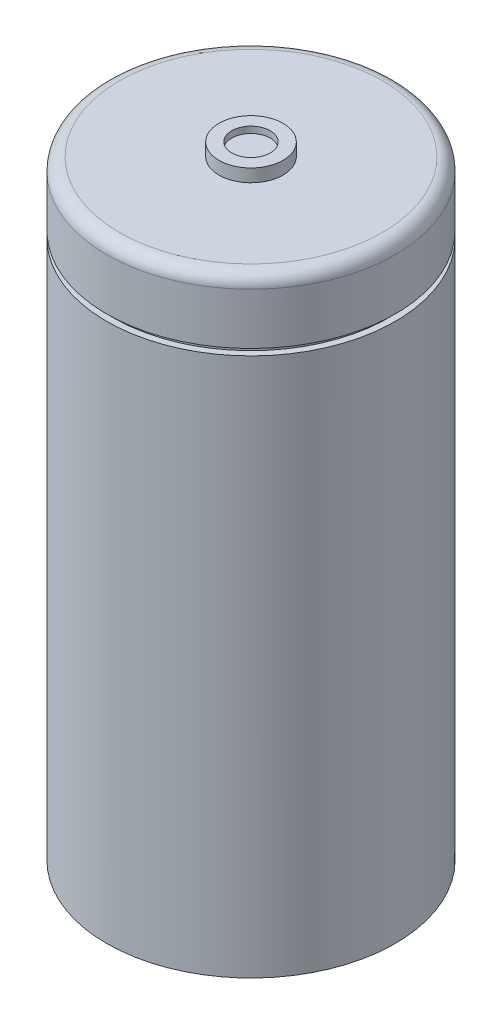
ISO-10303-21;
HEADER;
FILE_DESCRIPTION(('STEP AP214'),'2;1');
FILE_NAME('part.step','',(''),(''),'','','');
FILE_SCHEMA(('AUTOMOTIVE_DESIGN { 1 0 10303 214 1 1 1 1 }'));
ENDSEC;
DATA;
#1=APPLICATION_CONTEXT('core data for automotive mechanical design processes');
#2=APPLICATION_PROTOCOL_DEFINITION('international standard','automotive_design',2000,#1);
#3=PRODUCT_CONTEXT('',#1,'mechanical');
#4=PRODUCT('Part','Part','',(#3));
#5=PRODUCT_RELATED_PRODUCT_CATEGORY('part','',(#4));
#6=PRODUCT_DEFINITION_FORMATION('','',#4);
#7=PRODUCT_DEFINITION_CONTEXT('part definition',#1,'design');
#8=PRODUCT_DEFINITION('design','',#6,#7);
#9=PRODUCT_DEFINITION_SHAPE('','',#8);
#10=(LENGTH_UNIT() NAMED_UNIT(*) SI_UNIT(.MILLI.,.METRE.));
#11=(NAMED_UNIT(*) PLANE_ANGLE_UNIT() SI_UNIT($,.RADIAN.));
#12=(NAMED_UNIT(*) SI_UNIT($,.STERADIAN.) SOLID_ANGLE_UNIT());
#13=UNCERTAINTY_MEASURE_WITH_UNIT(LENGTH_MEASURE(1.E-05),#10,'distance_accuracy_value','');
#14=(GEOMETRIC_REPRESENTATION_CONTEXT(3) GLOBAL_UNCERTAINTY_ASSIGNED_CONTEXT((#13)) GLOBAL_UNIT_ASSIGNED_CONTEXT((#10,
#11,#12)) REPRESENTATION_CONTEXT('',''));
#15=CARTESIAN_POINT('',(0.,0.,0.));
#16=DIRECTION('',(0.,0.,1.));
#17=DIRECTION('',(1.,0.,0.));
#18=AXIS2_PLACEMENT_3D('',#15,#16,#17);
#19=CARTESIAN_POINT('',(0.,95.,0.));
#20=DIRECTION('',(0.,-1.,0.));
#21=DIRECTION('',(0.,0.,-1.));
#22=AXIS2_PLACEMENT_3D('',#19,#20,#21);
#23=CYLINDRICAL_SURFACE('',#22,22.5);
#24=CARTESIAN_POINT('',(0.,0.,0.));
#25=DIRECTION('',(0.,1.,0.));
#26=DIRECTION('',(0.,0.,1.));
#27=AXIS2_PLACEMENT_3D('',#24,#25,#26);
#28=CIRCLE('',#27,22.5);
#29=CARTESIAN_POINT('',(0.,0.,22.5));
#30=VERTEX_POINT('',#29);
#31=EDGE_CURVE('E43',#30,#30,#28,.T.);
#32=ORIENTED_EDGE('',*,*,#31,.T.);
#33=EDGE_LOOP('',(#32));
#34=FACE_BOUND('',#33,.T.);
#35=CARTESIAN_POINT('',(0.,84.,0.));
#36=DIRECTION('',(0.,1.,0.));
#37=DIRECTION('',(-1.,0.,0.));
#38=AXIS2_PLACEMENT_3D('',#35,#36,#37);
#39=CIRCLE('',#38,22.5);
#40=CARTESIAN_POINT('',(-22.5,84.,0.));
#41=VERTEX_POINT('',#40);
#42=EDGE_CURVE('E47',#41,#41,#39,.T.);
#43=ORIENTED_EDGE('',*,*,#42,.F.);
#44=EDGE_LOOP('',(#43));
#45=FACE_BOUND('',#44,.T.);
#46=ADVANCED_FACE('F32',(#34,#45),#23,.T.);
#47=CARTESIAN_POINT('',(0.,0.,0.));
#48=DIRECTION('',(0.,1.,0.));
#49=DIRECTION('',(0.,0.,1.));
#50=AXIS2_PLACEMENT_3D('',#47,#48,#49);
#51=PLANE('',#50);
#52=ORIENTED_EDGE('',*,*,#31,.F.);
#53=EDGE_LOOP('',(#52));
#54=FACE_BOUND('',#53,.T.);
#55=ADVANCED_FACE('F109',(#54),#51,.F.);
#56=CARTESIAN_POINT('',(22.5,84.,0.));
#57=DIRECTION('',(0.,1.,0.));
#58=DIRECTION('',(-1.,0.,0.));
#59=AXIS2_PLACEMENT_3D('',#56,#57,#58);
#60=PLANE('',#59);
#61=ORIENTED_EDGE('',*,*,#42,.T.);
#62=EDGE_LOOP('',(#61));
#63=FACE_BOUND('',#62,.T.);
#64=CARTESIAN_POINT('',(0.,84.,0.));
#65=DIRECTION('',(0.,1.,0.));
#66=DIRECTION('',(-1.,0.,0.));
#67=AXIS2_PLACEMENT_3D('',#64,#65,#66);
#68=CIRCLE('',#67,21.5);
#69=CARTESIAN_POINT('',(-21.5,84.,0.));
#70=VERTEX_POINT('',#69);
#71=EDGE_CURVE('E52',#70,#70,#68,.T.);
#72=ORIENTED_EDGE('',*,*,#71,.F.);
#73=EDGE_LOOP('',(#72));
#74=FACE_BOUND('',#73,.T.);
#75=ADVANCED_FACE('F114',(#63,#74),#60,.T.);
#76=CARTESIAN_POINT('',(0.,95.,0.));
#77=DIRECTION('',(0.,1.,0.));
#78=DIRECTION('',(-1.,0.,0.));
#79=AXIS2_PLACEMENT_3D('',#76,#77,#78);
#80=CYLINDRICAL_SURFACE('',#79,21.5);
#81=ORIENTED_EDGE('',*,*,#71,.T.);
#82=EDGE_LOOP('',(#81));
#83=FACE_BOUND('',#82,.T.);
#84=CARTESIAN_POINT('',(0.,85.,0.));
#85=DIRECTION('',(0.,1.,0.));
#86=DIRECTION('',(-1.,0.,0.));
#87=AXIS2_PLACEMENT_3D('',#84,#85,#86);
#88=CIRCLE('',#87,21.5);
#89=CARTESIAN_POINT('',(-21.5,85.,0.));
#90=VERTEX_POINT('',#89);
#91=EDGE_CURVE('E55',#90,#90,#88,.T.);
#92=ORIENTED_EDGE('',*,*,#91,.F.);
#93=EDGE_LOOP('',(#92));
#94=FACE_BOUND('',#93,.T.);
#95=ADVANCED_FACE('F103',(#83,#94),#80,.T.);
#96=CARTESIAN_POINT('',(21.5,85.,0.));
#97=DIRECTION('',(0.,-1.,0.));
#98=DIRECTION('',(1.,0.,0.));
#99=AXIS2_PLACEMENT_3D('',#96,#97,#98);
#100=PLANE('',#99);
#101=ORIENTED_EDGE('',*,*,#91,.T.);
#102=EDGE_LOOP('',(#101));
#103=FACE_BOUND('',#102,.T.);
#104=CARTESIAN_POINT('',(0.,85.,0.));
#105=DIRECTION('',(0.,1.,0.));
#106=DIRECTION('',(-1.,0.,0.));
#107=AXIS2_PLACEMENT_3D('',#104,#105,#106);
#108=CIRCLE('',#107,22.5);
#109=CARTESIAN_POINT('',(-22.5,85.,0.));
#110=VERTEX_POINT('',#109);
#111=EDGE_CURVE('E58',#110,#110,#108,.T.);
#112=ORIENTED_EDGE('',*,*,#111,.F.);
#113=EDGE_LOOP('',(#112));
#114=FACE_BOUND('',#113,.T.);
#115=ADVANCED_FACE('F97',(#103,#114),#100,.T.);
#116=CARTESIAN_POINT('',(0.,95.,0.));
#117=DIRECTION('',(0.,1.,0.));
#118=DIRECTION('',(0.,0.,1.));
#119=AXIS2_PLACEMENT_3D('',#116,#117,#118);
#120=PLANE('',#119);
#121=CARTESIAN_POINT('',(0.,95.,0.));
#122=DIRECTION('',(0.,1.,0.));
#123=DIRECTION('',(0.,0.,1.));
#124=AXIS2_PLACEMENT_3D('',#121,#122,#123);
#125=CIRCLE('',#124,5.);
#126=CARTESIAN_POINT('',(0.,95.,5.));
#127=VERTEX_POINT('',#126);
#128=EDGE_CURVE('E62',#127,#127,#125,.T.);
#129=ORIENTED_EDGE('',*,*,#128,.F.);
#130=EDGE_LOOP('',(#129));
#131=FACE_BOUND('',#130,.T.);
#132=CARTESIAN_POINT('',(0.,95.,0.));
#133=DIRECTION('',(0.,1.,0.));
#134=DIRECTION('',(0.,0.,1.));
#135=AXIS2_PLACEMENT_3D('',#132,#133,#134);
#136=CIRCLE('',#135,20.5);
#137=CARTESIAN_POINT('',(0.,95.,20.5));
#138=VERTEX_POINT('',#137);
#139=EDGE_CURVE('E39',#138,#138,#136,.T.);
#140=ORIENTED_EDGE('',*,*,#139,.T.);
#141=EDGE_LOOP('',(#140));
#142=FACE_BOUND('',#141,.T.);
#143=ADVANCED_FACE('F94',(#131,#142),#120,.T.);
#144=CARTESIAN_POINT('',(0.,93.,0.));
#145=DIRECTION('',(0.,1.,0.));
#146=DIRECTION('',(0.,0.,1.));
#147=AXIS2_PLACEMENT_3D('',#144,#145,#146);
#148=CIRCLE('',#147,22.5);
#149=CARTESIAN_POINT('',(0.,93.,22.5));
#150=VERTEX_POINT('',#149);
#151=EDGE_CURVE('E10',#150,#150,#148,.F.);
#152=ORIENTED_EDGE('',*,*,#151,.T.);
#153=EDGE_LOOP('',(#152));
#154=FACE_BOUND('',#153,.T.);
#155=ORIENTED_EDGE('',*,*,#111,.T.);
#156=EDGE_LOOP('',(#155));
#157=FACE_BOUND('',#156,.T.);
#158=ADVANCED_FACE('F96',(#154,#157),#23,.T.);
#159=CARTESIAN_POINT('',(0.,93.,0.));
#160=DIRECTION('',(0.,1.,0.));
#161=DIRECTION('',(0.,0.,1.));
#162=AXIS2_PLACEMENT_3D('',#159,#160,#161);
#163=TOROIDAL_SURFACE('',#162,20.5,2.);
#164=ORIENTED_EDGE('',*,*,#151,.F.);
#165=EDGE_LOOP('',(#164));
#166=FACE_BOUND('',#165,.T.);
#167=ORIENTED_EDGE('',*,*,#139,.F.);
#168=EDGE_LOOP('',(#167));
#169=FACE_BOUND('',#168,.T.);
#170=ADVANCED_FACE('F34',(#166,#169),#163,.T.);
#171=CARTESIAN_POINT('',(0.,97.,0.));
#172=DIRECTION('',(0.,-1.,0.));
#173=DIRECTION('',(0.,0.,-1.));
#174=AXIS2_PLACEMENT_3D('',#171,#172,#173);
#175=CYLINDRICAL_SURFACE('',#174,5.);
#176=CARTESIAN_POINT('',(0.,97.,0.));
#177=DIRECTION('',(0.,1.,0.));
#178=DIRECTION('',(0.,0.,1.));
#179=AXIS2_PLACEMENT_3D('',#176,#177,#178);
#180=CIRCLE('',#179,5.);
#181=CARTESIAN_POINT('',(0.,97.,5.));
#182=VERTEX_POINT('',#181);
#183=EDGE_CURVE('E61',#182,#182,#180,.T.);
#184=ORIENTED_EDGE('',*,*,#183,.F.);
#185=EDGE_LOOP('',(#184));
#186=FACE_BOUND('',#185,.T.);
#187=ORIENTED_EDGE('',*,*,#128,.T.);
#188=EDGE_LOOP('',(#187));
#189=FACE_BOUND('',#188,.T.);
#190=ADVANCED_FACE('F85',(#186,#189),#175,.T.);
#191=CARTESIAN_POINT('',(0.,97.,0.));
#192=DIRECTION('',(0.,1.,0.));
#193=DIRECTION('',(0.,0.,1.));
#194=AXIS2_PLACEMENT_3D('',#191,#192,#193);
#195=PLANE('',#194);
#196=CARTESIAN_POINT('',(0.,97.,0.));
#197=DIRECTION('',(0.,1.,0.));
#198=DIRECTION('',(0.,0.,1.));
#199=AXIS2_PLACEMENT_3D('',#196,#197,#198);
#200=CIRCLE('',#199,3.);
#201=CARTESIAN_POINT('',(0.,97.,3.));
#202=VERTEX_POINT('',#201);
#203=EDGE_CURVE('E68',#202,#202,#200,.T.);
#204=ORIENTED_EDGE('',*,*,#203,.F.);
#205=EDGE_LOOP('',(#204));
#206=FACE_BOUND('',#205,.T.);
#207=ORIENTED_EDGE('',*,*,#183,.T.);
#208=EDGE_LOOP('',(#207));
#209=FACE_BOUND('',#208,.T.);
#210=ADVANCED_FACE('F79',(#206,#209),#195,.T.);
#211=CARTESIAN_POINT('',(0.,96.,0.));
#212=DIRECTION('',(0.,1.,0.));
#213=DIRECTION('',(0.,0.,1.));
#214=AXIS2_PLACEMENT_3D('',#211,#212,#213);
#215=CYLINDRICAL_SURFACE('',#214,3.);
#216=CARTESIAN_POINT('',(0.,96.,0.));
#217=DIRECTION('',(0.,1.,0.));
#218=DIRECTION('',(0.,0.,1.));
#219=AXIS2_PLACEMENT_3D('',#216,#217,#218);
#220=CIRCLE('',#219,3.);
#221=CARTESIAN_POINT('',(0.,96.,3.));
#222=VERTEX_POINT('',#221);
#223=EDGE_CURVE('E65',#222,#222,#220,.T.);
#224=ORIENTED_EDGE('',*,*,#223,.F.);
#225=EDGE_LOOP('',(#224));
#226=FACE_BOUND('',#225,.T.);
#227=ORIENTED_EDGE('',*,*,#203,.T.);
#228=EDGE_LOOP('',(#227));
#229=FACE_BOUND('',#228,.T.);
#230=ADVANCED_FACE('F76',(#226,#229),#215,.F.);
#231=CARTESIAN_POINT('',(0.,96.,0.));
#232=DIRECTION('',(0.,1.,0.));
#233=DIRECTION('',(0.,0.,1.));
#234=AXIS2_PLACEMENT_3D('',#231,#232,#233);
#235=PLANE('',#234);
#236=ORIENTED_EDGE('',*,*,#223,.T.);
#237=EDGE_LOOP('',(#236));
#238=FACE_BOUND('',#237,.T.);
#239=ADVANCED_FACE('F74',(#238),#235,.T.);
#240=CLOSED_SHELL('',(#46,#55,#75,#95,#115,#143,#158,#170,#190,#210,#230,#239));
#241=MANIFOLD_SOLID_BREP('B2',#240);
#242=ADVANCED_BREP_SHAPE_REPRESENTATION('',(#18,#241),#14);
#243=SHAPE_DEFINITION_REPRESENTATION(#9,#242);
ENDSEC;
END-ISO-10303-21;
